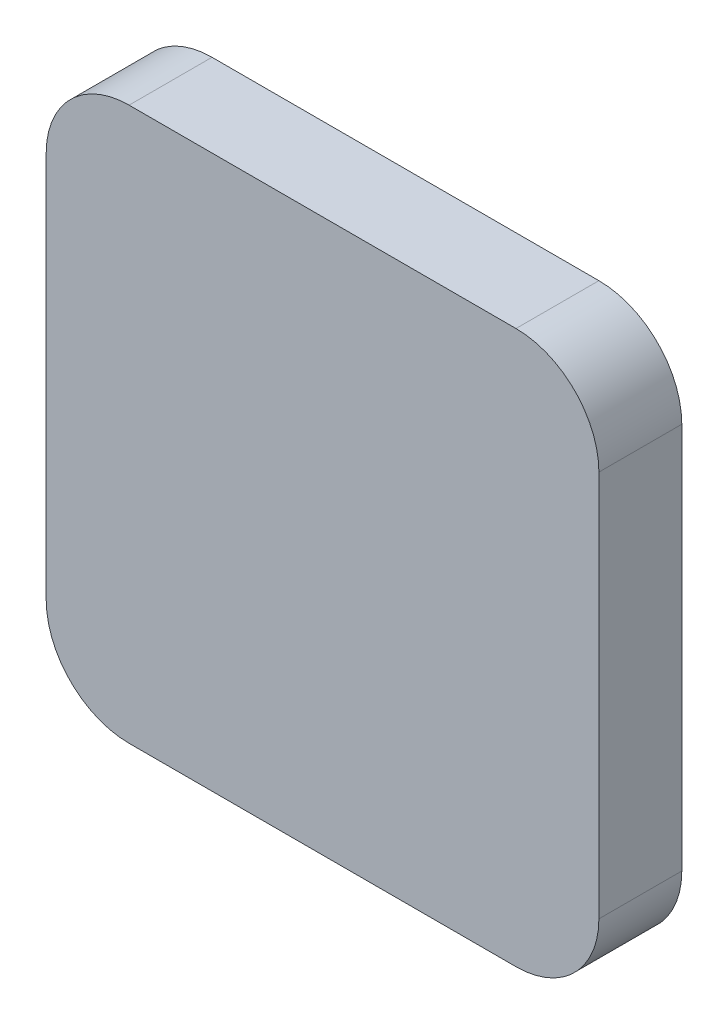
ISO-10303-21;
HEADER;
FILE_DESCRIPTION(('STEP AP214'),'2;1');
FILE_NAME('part.step','',(''),(''),'','','');
FILE_SCHEMA(('AUTOMOTIVE_DESIGN { 1 0 10303 214 1 1 1 1 }'));
ENDSEC;
DATA;
#1=APPLICATION_CONTEXT('core data for automotive mechanical design processes');
#2=APPLICATION_PROTOCOL_DEFINITION('international standard','automotive_design',2000,#1);
#3=PRODUCT_CONTEXT('',#1,'mechanical');
#4=PRODUCT('Part','Part','',(#3));
#5=PRODUCT_RELATED_PRODUCT_CATEGORY('part','',(#4));
#6=PRODUCT_DEFINITION_FORMATION('','',#4);
#7=PRODUCT_DEFINITION_CONTEXT('part definition',#1,'design');
#8=PRODUCT_DEFINITION('design','',#6,#7);
#9=PRODUCT_DEFINITION_SHAPE('','',#8);
#10=(LENGTH_UNIT() NAMED_UNIT(*) SI_UNIT(.MILLI.,.METRE.));
#11=(NAMED_UNIT(*) PLANE_ANGLE_UNIT() SI_UNIT($,.RADIAN.));
#12=(NAMED_UNIT(*) SI_UNIT($,.STERADIAN.) SOLID_ANGLE_UNIT());
#13=UNCERTAINTY_MEASURE_WITH_UNIT(LENGTH_MEASURE(1.E-05),#10,'distance_accuracy_value','');
#14=(GEOMETRIC_REPRESENTATION_CONTEXT(3) GLOBAL_UNCERTAINTY_ASSIGNED_CONTEXT((#13)) GLOBAL_UNIT_ASSIGNED_CONTEXT((#10,
#11,#12)) REPRESENTATION_CONTEXT('',''));
#15=CARTESIAN_POINT('',(0.,0.,0.));
#16=DIRECTION('',(0.,0.,1.));
#17=DIRECTION('',(1.,0.,0.));
#18=AXIS2_PLACEMENT_3D('',#15,#16,#17);
#19=CARTESIAN_POINT('',(-7.,-7.,3.));
#20=DIRECTION('',(0.,0.,-1.));
#21=DIRECTION('',(-1.,0.,0.));
#22=AXIS2_PLACEMENT_3D('',#19,#20,#21);
#23=CYLINDRICAL_SURFACE('',#22,3.);
#24=CARTESIAN_POINT('',(-7.,-7.,0.));
#25=DIRECTION('',(0.,0.,1.));
#26=DIRECTION('',(1.,0.,0.));
#27=AXIS2_PLACEMENT_3D('',#24,#25,#26);
#28=CIRCLE('',#27,3.);
#29=CARTESIAN_POINT('',(-10.,-7.,0.));
#30=VERTEX_POINT('',#29);
#31=CARTESIAN_POINT('',(-7.,-10.,0.));
#32=VERTEX_POINT('',#31);
#33=EDGE_CURVE('E132',#30,#32,#28,.T.);
#34=ORIENTED_EDGE('',*,*,#33,.T.);
#35=DIRECTION('',(0.,0.,-1.));
#36=VECTOR('',#35,1.);
#37=CARTESIAN_POINT('',(-7.,-10.,3.));
#38=LINE('',#37,#36);
#39=CARTESIAN_POINT('',(-7.,-10.,3.));
#40=VERTEX_POINT('',#39);
#41=EDGE_CURVE('E11',#40,#32,#38,.T.);
#42=ORIENTED_EDGE('',*,*,#41,.F.);
#43=CARTESIAN_POINT('',(-7.,-7.,3.));
#44=DIRECTION('',(0.,0.,1.));
#45=DIRECTION('',(1.,0.,0.));
#46=AXIS2_PLACEMENT_3D('',#43,#44,#45);
#47=CIRCLE('',#46,3.);
#48=CARTESIAN_POINT('',(-10.,-7.,3.));
#49=VERTEX_POINT('',#48);
#50=EDGE_CURVE('E146',#49,#40,#47,.T.);
#51=ORIENTED_EDGE('',*,*,#50,.F.);
#52=DIRECTION('',(0.,0.,-1.));
#53=VECTOR('',#52,1.);
#54=CARTESIAN_POINT('',(-10.,-7.,3.));
#55=LINE('',#54,#53);
#56=EDGE_CURVE('E128',#49,#30,#55,.T.);
#57=ORIENTED_EDGE('',*,*,#56,.T.);
#58=EDGE_LOOP('',(#34,#42,#51,#57));
#59=FACE_BOUND('',#58,.T.);
#60=ADVANCED_FACE('F36',(#59),#23,.T.);
#61=CARTESIAN_POINT('',(-7.,-10.,3.));
#62=DIRECTION('',(0.,1.,0.));
#63=DIRECTION('',(0.,0.,1.));
#64=AXIS2_PLACEMENT_3D('',#61,#62,#63);
#65=PLANE('',#64);
#66=DIRECTION('',(1.,0.,0.));
#67=VECTOR('',#66,1.);
#68=CARTESIAN_POINT('',(-7.,-10.,0.));
#69=LINE('',#68,#67);
#70=CARTESIAN_POINT('',(7.,-10.,0.));
#71=VERTEX_POINT('',#70);
#72=EDGE_CURVE('E135',#32,#71,#69,.T.);
#73=ORIENTED_EDGE('',*,*,#72,.T.);
#74=DIRECTION('',(0.,0.,-1.));
#75=VECTOR('',#74,1.);
#76=CARTESIAN_POINT('',(7.,-10.,3.));
#77=LINE('',#76,#75);
#78=CARTESIAN_POINT('',(7.,-10.,3.));
#79=VERTEX_POINT('',#78);
#80=EDGE_CURVE('E44',#79,#71,#77,.T.);
#81=ORIENTED_EDGE('',*,*,#80,.F.);
#82=DIRECTION('',(1.,0.,0.));
#83=VECTOR('',#82,1.);
#84=CARTESIAN_POINT('',(-7.,-10.,3.));
#85=LINE('',#84,#83);
#86=EDGE_CURVE('E95',#40,#79,#85,.T.);
#87=ORIENTED_EDGE('',*,*,#86,.F.);
#88=ORIENTED_EDGE('',*,*,#41,.T.);
#89=EDGE_LOOP('',(#73,#81,#87,#88));
#90=FACE_BOUND('',#89,.T.);
#91=ADVANCED_FACE('F181',(#90),#65,.F.);
#92=CARTESIAN_POINT('',(7.,-7.,3.));
#93=DIRECTION('',(0.,0.,-1.));
#94=DIRECTION('',(-1.,0.,0.));
#95=AXIS2_PLACEMENT_3D('',#92,#93,#94);
#96=CYLINDRICAL_SURFACE('',#95,3.);
#97=CARTESIAN_POINT('',(7.,-7.,0.));
#98=DIRECTION('',(0.,0.,1.));
#99=DIRECTION('',(1.,0.,0.));
#100=AXIS2_PLACEMENT_3D('',#97,#98,#99);
#101=CIRCLE('',#100,3.);
#102=CARTESIAN_POINT('',(10.,-7.,0.));
#103=VERTEX_POINT('',#102);
#104=EDGE_CURVE('E137',#71,#103,#101,.T.);
#105=ORIENTED_EDGE('',*,*,#104,.T.);
#106=DIRECTION('',(0.,0.,-1.));
#107=VECTOR('',#106,1.);
#108=CARTESIAN_POINT('',(10.,-7.,3.));
#109=LINE('',#108,#107);
#110=CARTESIAN_POINT('',(10.,-7.,3.));
#111=VERTEX_POINT('',#110);
#112=EDGE_CURVE('E153',#111,#103,#109,.T.);
#113=ORIENTED_EDGE('',*,*,#112,.F.);
#114=CARTESIAN_POINT('',(7.,-7.,3.));
#115=DIRECTION('',(0.,0.,1.));
#116=DIRECTION('',(1.,0.,0.));
#117=AXIS2_PLACEMENT_3D('',#114,#115,#116);
#118=CIRCLE('',#117,3.);
#119=EDGE_CURVE('E161',#79,#111,#118,.T.);
#120=ORIENTED_EDGE('',*,*,#119,.F.);
#121=ORIENTED_EDGE('',*,*,#80,.T.);
#122=EDGE_LOOP('',(#105,#113,#120,#121));
#123=FACE_BOUND('',#122,.T.);
#124=ADVANCED_FACE('F159',(#123),#96,.T.);
#125=CARTESIAN_POINT('',(10.,7.,3.));
#126=DIRECTION('',(-1.,0.,0.));
#127=DIRECTION('',(0.,-1.,0.));
#128=AXIS2_PLACEMENT_3D('',#125,#126,#127);
#129=PLANE('',#128);
#130=DIRECTION('',(0.,1.,0.));
#131=VECTOR('',#130,1.);
#132=CARTESIAN_POINT('',(10.,7.,0.));
#133=LINE('',#132,#131);
#134=CARTESIAN_POINT('',(10.,7.,0.));
#135=VERTEX_POINT('',#134);
#136=EDGE_CURVE('E139',#103,#135,#133,.T.);
#137=ORIENTED_EDGE('',*,*,#136,.T.);
#138=DIRECTION('',(0.,0.,-1.));
#139=VECTOR('',#138,1.);
#140=CARTESIAN_POINT('',(10.,7.,3.));
#141=LINE('',#140,#139);
#142=CARTESIAN_POINT('',(10.,7.,3.));
#143=VERTEX_POINT('',#142);
#144=EDGE_CURVE('E150',#143,#135,#141,.T.);
#145=ORIENTED_EDGE('',*,*,#144,.F.);
#146=DIRECTION('',(0.,1.,0.));
#147=VECTOR('',#146,1.);
#148=CARTESIAN_POINT('',(10.,7.,3.));
#149=LINE('',#148,#147);
#150=EDGE_CURVE('E173',#111,#143,#149,.T.);
#151=ORIENTED_EDGE('',*,*,#150,.F.);
#152=ORIENTED_EDGE('',*,*,#112,.T.);
#153=EDGE_LOOP('',(#137,#145,#151,#152));
#154=FACE_BOUND('',#153,.T.);
#155=ADVANCED_FACE('F169',(#154),#129,.F.);
#156=CARTESIAN_POINT('',(7.,7.,3.));
#157=DIRECTION('',(0.,0.,-1.));
#158=DIRECTION('',(-1.,0.,0.));
#159=AXIS2_PLACEMENT_3D('',#156,#157,#158);
#160=CYLINDRICAL_SURFACE('',#159,3.);
#161=CARTESIAN_POINT('',(7.,7.,0.));
#162=DIRECTION('',(0.,0.,1.));
#163=DIRECTION('',(-1.,0.,0.));
#164=AXIS2_PLACEMENT_3D('',#161,#162,#163);
#165=CIRCLE('',#164,3.);
#166=CARTESIAN_POINT('',(7.,10.,0.));
#167=VERTEX_POINT('',#166);
#168=EDGE_CURVE('E141',#135,#167,#165,.T.);
#169=ORIENTED_EDGE('',*,*,#168,.T.);
#170=DIRECTION('',(0.,0.,-1.));
#171=VECTOR('',#170,1.);
#172=CARTESIAN_POINT('',(7.,10.,3.));
#173=LINE('',#172,#171);
#174=CARTESIAN_POINT('',(7.,10.,3.));
#175=VERTEX_POINT('',#174);
#176=EDGE_CURVE('E123',#175,#167,#173,.T.);
#177=ORIENTED_EDGE('',*,*,#176,.F.);
#178=CARTESIAN_POINT('',(7.,7.,3.));
#179=DIRECTION('',(0.,0.,1.));
#180=DIRECTION('',(-1.,0.,0.));
#181=AXIS2_PLACEMENT_3D('',#178,#179,#180);
#182=CIRCLE('',#181,3.);
#183=EDGE_CURVE('E114',#143,#175,#182,.T.);
#184=ORIENTED_EDGE('',*,*,#183,.F.);
#185=ORIENTED_EDGE('',*,*,#144,.T.);
#186=EDGE_LOOP('',(#169,#177,#184,#185));
#187=FACE_BOUND('',#186,.T.);
#188=ADVANCED_FACE('F172',(#187),#160,.T.);
#189=CARTESIAN_POINT('',(-6.99999999999998,10.,3.));
#190=DIRECTION('',(0.,-1.,0.));
#191=DIRECTION('',(0.,0.,-1.));
#192=AXIS2_PLACEMENT_3D('',#189,#190,#191);
#193=PLANE('',#192);
#194=DIRECTION('',(-1.,0.,0.));
#195=VECTOR('',#194,1.);
#196=CARTESIAN_POINT('',(-6.99999999999998,10.,0.));
#197=LINE('',#196,#195);
#198=CARTESIAN_POINT('',(-6.99999999999998,10.,0.));
#199=VERTEX_POINT('',#198);
#200=EDGE_CURVE('E122',#167,#199,#197,.T.);
#201=ORIENTED_EDGE('',*,*,#200,.T.);
#202=DIRECTION('',(0.,0.,-1.));
#203=VECTOR('',#202,1.);
#204=CARTESIAN_POINT('',(-6.99999999999998,10.,3.));
#205=LINE('',#204,#203);
#206=CARTESIAN_POINT('',(-6.99999999999998,10.,3.));
#207=VERTEX_POINT('',#206);
#208=EDGE_CURVE('E119',#207,#199,#205,.T.);
#209=ORIENTED_EDGE('',*,*,#208,.F.);
#210=DIRECTION('',(-1.,0.,0.));
#211=VECTOR('',#210,1.);
#212=CARTESIAN_POINT('',(-6.99999999999998,10.,3.));
#213=LINE('',#212,#211);
#214=EDGE_CURVE('E108',#175,#207,#213,.T.);
#215=ORIENTED_EDGE('',*,*,#214,.F.);
#216=ORIENTED_EDGE('',*,*,#176,.T.);
#217=EDGE_LOOP('',(#201,#209,#215,#216));
#218=FACE_BOUND('',#217,.T.);
#219=ADVANCED_FACE('F120',(#218),#193,.F.);
#220=CARTESIAN_POINT('',(-7.,7.,3.));
#221=DIRECTION('',(0.,0.,-1.));
#222=DIRECTION('',(-1.,0.,0.));
#223=AXIS2_PLACEMENT_3D('',#220,#221,#222);
#224=CYLINDRICAL_SURFACE('',#223,3.);
#225=CARTESIAN_POINT('',(-7.,7.,0.));
#226=DIRECTION('',(0.,0.,1.));
#227=DIRECTION('',(-1.,0.,0.));
#228=AXIS2_PLACEMENT_3D('',#225,#226,#227);
#229=CIRCLE('',#228,3.);
#230=CARTESIAN_POINT('',(-10.,6.99999999999998,0.));
#231=VERTEX_POINT('',#230);
#232=EDGE_CURVE('E81',#199,#231,#229,.T.);
#233=ORIENTED_EDGE('',*,*,#232,.T.);
#234=DIRECTION('',(0.,0.,-1.));
#235=VECTOR('',#234,1.);
#236=CARTESIAN_POINT('',(-10.,6.99999999999998,3.));
#237=LINE('',#236,#235);
#238=CARTESIAN_POINT('',(-10.,6.99999999999998,3.));
#239=VERTEX_POINT('',#238);
#240=EDGE_CURVE('E124',#239,#231,#237,.T.);
#241=ORIENTED_EDGE('',*,*,#240,.F.);
#242=CARTESIAN_POINT('',(-7.,7.,3.));
#243=DIRECTION('',(0.,0.,1.));
#244=DIRECTION('',(-1.,0.,0.));
#245=AXIS2_PLACEMENT_3D('',#242,#243,#244);
#246=CIRCLE('',#245,3.);
#247=EDGE_CURVE('E112',#207,#239,#246,.T.);
#248=ORIENTED_EDGE('',*,*,#247,.F.);
#249=ORIENTED_EDGE('',*,*,#208,.T.);
#250=EDGE_LOOP('',(#233,#241,#248,#249));
#251=FACE_BOUND('',#250,.T.);
#252=ADVANCED_FACE('F126',(#251),#224,.T.);
#253=CARTESIAN_POINT('',(-10.,6.99999999999998,3.));
#254=DIRECTION('',(1.,0.,0.));
#255=DIRECTION('',(0.,0.,-1.));
#256=AXIS2_PLACEMENT_3D('',#253,#254,#255);
#257=PLANE('',#256);
#258=DIRECTION('',(0.,-1.,0.));
#259=VECTOR('',#258,1.);
#260=CARTESIAN_POINT('',(-10.,6.99999999999998,0.));
#261=LINE('',#260,#259);
#262=EDGE_CURVE('E87',#231,#30,#261,.T.);
#263=ORIENTED_EDGE('',*,*,#262,.T.);
#264=ORIENTED_EDGE('',*,*,#56,.F.);
#265=DIRECTION('',(0.,-1.,0.));
#266=VECTOR('',#265,1.);
#267=CARTESIAN_POINT('',(-10.,6.99999999999998,3.));
#268=LINE('',#267,#266);
#269=EDGE_CURVE('E52',#239,#49,#268,.T.);
#270=ORIENTED_EDGE('',*,*,#269,.F.);
#271=ORIENTED_EDGE('',*,*,#240,.T.);
#272=EDGE_LOOP('',(#263,#264,#270,#271));
#273=FACE_BOUND('',#272,.T.);
#274=ADVANCED_FACE('F197',(#273),#257,.F.);
#275=CARTESIAN_POINT('',(-7.,-7.,3.));
#276=DIRECTION('',(0.,0.,1.));
#277=DIRECTION('',(1.,0.,0.));
#278=AXIS2_PLACEMENT_3D('',#275,#276,#277);
#279=PLANE('',#278);
#280=ORIENTED_EDGE('',*,*,#50,.T.);
#281=ORIENTED_EDGE('',*,*,#86,.T.);
#282=ORIENTED_EDGE('',*,*,#119,.T.);
#283=ORIENTED_EDGE('',*,*,#150,.T.);
#284=ORIENTED_EDGE('',*,*,#183,.T.);
#285=ORIENTED_EDGE('',*,*,#214,.T.);
#286=ORIENTED_EDGE('',*,*,#247,.T.);
#287=ORIENTED_EDGE('',*,*,#269,.T.);
#288=EDGE_LOOP('',(#280,#281,#282,#283,#284,#285,#286,#287));
#289=FACE_BOUND('',#288,.T.);
#290=ADVANCED_FACE('F110',(#289),#279,.T.);
#291=CARTESIAN_POINT('',(-7.,-7.,0.));
#292=DIRECTION('',(0.,0.,1.));
#293=DIRECTION('',(1.,0.,0.));
#294=AXIS2_PLACEMENT_3D('',#291,#292,#293);
#295=PLANE('',#294);
#296=ORIENTED_EDGE('',*,*,#33,.F.);
#297=ORIENTED_EDGE('',*,*,#262,.F.);
#298=ORIENTED_EDGE('',*,*,#232,.F.);
#299=ORIENTED_EDGE('',*,*,#200,.F.);
#300=ORIENTED_EDGE('',*,*,#168,.F.);
#301=ORIENTED_EDGE('',*,*,#136,.F.);
#302=ORIENTED_EDGE('',*,*,#104,.F.);
#303=ORIENTED_EDGE('',*,*,#72,.F.);
#304=EDGE_LOOP('',(#296,#297,#298,#299,#300,#301,#302,#303));
#305=FACE_BOUND('',#304,.T.);
#306=ADVANCED_FACE('F165',(#305),#295,.F.);
#307=CLOSED_SHELL('',(#60,#91,#124,#155,#188,#219,#252,#274,#290,#306));
#308=MANIFOLD_SOLID_BREP('B2',#307);
#309=ADVANCED_BREP_SHAPE_REPRESENTATION('',(#18,#308),#14);
#310=SHAPE_DEFINITION_REPRESENTATION(#9,#309);
ENDSEC;
END-ISO-10303-21;
